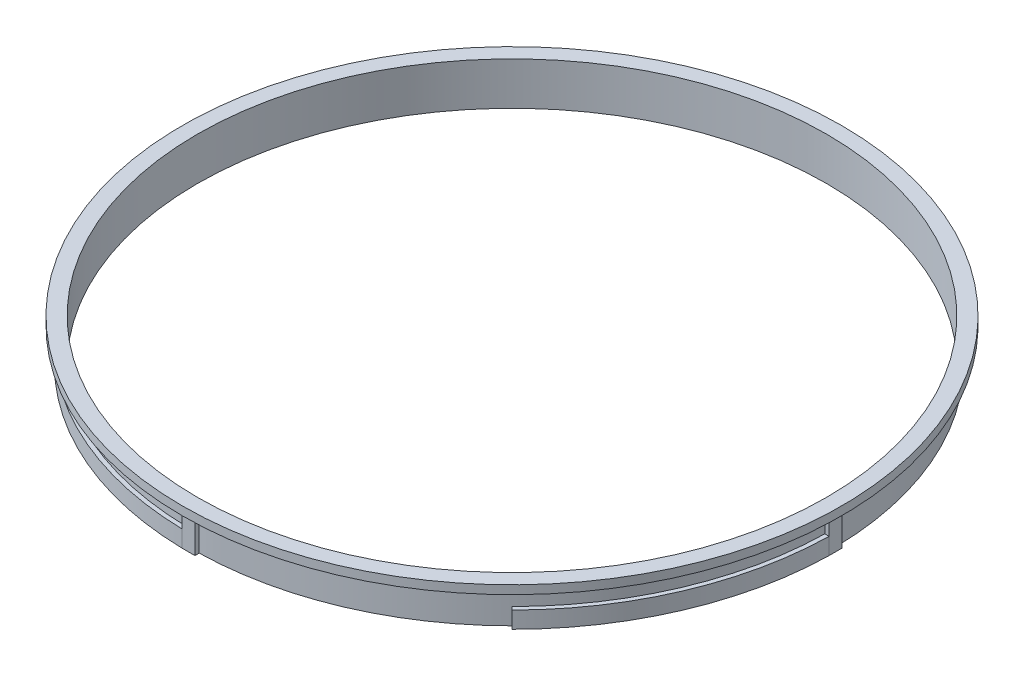
ISO-10303-21;
HEADER;
FILE_DESCRIPTION(('STEP AP214'),'2;1');
FILE_NAME('part.step','',(''),(''),'','','');
FILE_SCHEMA(('AUTOMOTIVE_DESIGN { 1 0 10303 214 1 1 1 1 }'));
ENDSEC;
DATA;
#1=APPLICATION_CONTEXT('core data for automotive mechanical design processes');
#2=APPLICATION_PROTOCOL_DEFINITION('international standard','automotive_design',2000,#1);
#3=PRODUCT_CONTEXT('',#1,'mechanical');
#4=PRODUCT('Part','Part','',(#3));
#5=PRODUCT_RELATED_PRODUCT_CATEGORY('part','',(#4));
#6=PRODUCT_DEFINITION_FORMATION('','',#4);
#7=PRODUCT_DEFINITION_CONTEXT('part definition',#1,'design');
#8=PRODUCT_DEFINITION('design','',#6,#7);
#9=PRODUCT_DEFINITION_SHAPE('','',#8);
#10=(LENGTH_UNIT() NAMED_UNIT(*) SI_UNIT(.MILLI.,.METRE.));
#11=(NAMED_UNIT(*) PLANE_ANGLE_UNIT() SI_UNIT($,.RADIAN.));
#12=(NAMED_UNIT(*) SI_UNIT($,.STERADIAN.) SOLID_ANGLE_UNIT());
#13=UNCERTAINTY_MEASURE_WITH_UNIT(LENGTH_MEASURE(1.E-05),#10,'distance_accuracy_value','');
#14=(GEOMETRIC_REPRESENTATION_CONTEXT(3) GLOBAL_UNCERTAINTY_ASSIGNED_CONTEXT((#13)) GLOBAL_UNIT_ASSIGNED_CONTEXT((#10,
#11,#12)) REPRESENTATION_CONTEXT('',''));
#15=CARTESIAN_POINT('',(0.,0.,0.));
#16=DIRECTION('',(0.,0.,1.));
#17=DIRECTION('',(1.,0.,0.));
#18=AXIS2_PLACEMENT_3D('',#15,#16,#17);
#19=CARTESIAN_POINT('',(0.,10.,0.));
#20=DIRECTION('',(0.,-1.,0.));
#21=DIRECTION('',(0.,0.,-1.));
#22=AXIS2_PLACEMENT_3D('',#19,#20,#21);
#23=CYLINDRICAL_SURFACE('',#22,74.6);
#24=CARTESIAN_POINT('',(0.,8.,0.));
#25=DIRECTION('',(0.,1.,0.));
#26=DIRECTION('',(0.,0.,1.));
#27=AXIS2_PLACEMENT_3D('',#24,#25,#26);
#28=CIRCLE('',#27,74.6);
#29=CARTESIAN_POINT('',(-1.50000000000001,8.,-74.5849180464791));
#30=VERTEX_POINT('',#29);
#31=CARTESIAN_POINT('',(-74.5849180464791,8.,-1.49999999999999));
#32=VERTEX_POINT('',#31);
#33=EDGE_CURVE('E459',#30,#32,#28,.T.);
#34=ORIENTED_EDGE('',*,*,#33,.F.);
#35=DIRECTION('',(0.,-1.,0.));
#36=VECTOR('',#35,1.);
#37=CARTESIAN_POINT('',(-1.50000000000001,13.1622776601684,-74.5849180464791));
#38=LINE('',#37,#36);
#39=CARTESIAN_POINT('',(-1.50000000000001,0.,-74.5849180464791));
#40=VERTEX_POINT('',#39);
#41=EDGE_CURVE('E228',#30,#40,#38,.T.);
#42=ORIENTED_EDGE('',*,*,#41,.T.);
#43=CARTESIAN_POINT('',(0.,0.,0.));
#44=DIRECTION('',(0.,1.,0.));
#45=DIRECTION('',(0.,0.,1.));
#46=AXIS2_PLACEMENT_3D('',#43,#44,#45);
#47=CIRCLE('',#46,74.6);
#48=CARTESIAN_POINT('',(-52.7501658765166,0.,-52.7501658765166));
#49=VERTEX_POINT('',#48);
#50=EDGE_CURVE('E424',#40,#49,#47,.T.);
#51=ORIENTED_EDGE('',*,*,#50,.T.);
#52=DIRECTION('',(0.,-1.,0.));
#53=VECTOR('',#52,1.);
#54=CARTESIAN_POINT('',(-52.7501658765166,3.9,-52.7501658765166));
#55=LINE('',#54,#53);
#56=CARTESIAN_POINT('',(-52.7501658765166,3.9,-52.7501658765166));
#57=VERTEX_POINT('',#56);
#58=EDGE_CURVE('E315',#57,#49,#55,.T.);
#59=ORIENTED_EDGE('',*,*,#58,.F.);
#60=CARTESIAN_POINT('',(0.,3.9,0.));
#61=DIRECTION('',(0.,1.,0.));
#62=DIRECTION('',(0.,0.,1.));
#63=AXIS2_PLACEMENT_3D('',#60,#61,#62);
#64=CIRCLE('',#63,74.6);
#65=CARTESIAN_POINT('',(-74.5849180464791,3.9,-1.49999999999997));
#66=VERTEX_POINT('',#65);
#67=EDGE_CURVE('E303',#57,#66,#64,.T.);
#68=ORIENTED_EDGE('',*,*,#67,.T.);
#69=DIRECTION('',(0.,-1.,0.));
#70=VECTOR('',#69,1.);
#71=CARTESIAN_POINT('',(-74.5849180464791,13.1622776601684,-1.49999999999999));
#72=LINE('',#71,#70);
#73=EDGE_CURVE('E386',#32,#66,#72,.T.);
#74=ORIENTED_EDGE('',*,*,#73,.F.);
#75=EDGE_LOOP('',(#34,#42,#51,#59,#68,#74));
#76=FACE_BOUND('',#75,.T.);
#77=ADVANCED_FACE('F39',(#76),#23,.T.);
#78=CARTESIAN_POINT('',(74.5849180464791,8.,-1.5));
#79=VERTEX_POINT('',#78);
#80=CARTESIAN_POINT('',(1.49999999999999,8.,-74.5849180464791));
#81=VERTEX_POINT('',#80);
#82=EDGE_CURVE('E239',#79,#81,#28,.T.);
#83=ORIENTED_EDGE('',*,*,#82,.F.);
#84=DIRECTION('',(0.,-1.,0.));
#85=VECTOR('',#84,1.);
#86=CARTESIAN_POINT('',(74.5849180464791,13.1622776601684,-1.5));
#87=LINE('',#86,#85);
#88=CARTESIAN_POINT('',(74.5849180464791,0.,-1.5));
#89=VERTEX_POINT('',#88);
#90=EDGE_CURVE('E393',#79,#89,#87,.T.);
#91=ORIENTED_EDGE('',*,*,#90,.T.);
#92=CARTESIAN_POINT('',(52.7501658765166,0.,-52.7501658765166));
#93=VERTEX_POINT('',#92);
#94=EDGE_CURVE('E46',#89,#93,#47,.T.);
#95=ORIENTED_EDGE('',*,*,#94,.T.);
#96=DIRECTION('',(0.,-1.,0.));
#97=VECTOR('',#96,1.);
#98=CARTESIAN_POINT('',(52.7501658765166,3.9,-52.7501658765166));
#99=LINE('',#98,#97);
#100=CARTESIAN_POINT('',(52.7501658765166,3.9,-52.7501658765166));
#101=VERTEX_POINT('',#100);
#102=EDGE_CURVE('E222',#101,#93,#99,.T.);
#103=ORIENTED_EDGE('',*,*,#102,.F.);
#104=CARTESIAN_POINT('',(0.,3.9,0.));
#105=DIRECTION('',(0.,1.,0.));
#106=DIRECTION('',(0.,0.,1.));
#107=AXIS2_PLACEMENT_3D('',#104,#105,#106);
#108=CIRCLE('',#107,74.6);
#109=CARTESIAN_POINT('',(1.49999999999999,3.9,-74.5849180464791));
#110=VERTEX_POINT('',#109);
#111=EDGE_CURVE('E346',#101,#110,#108,.T.);
#112=ORIENTED_EDGE('',*,*,#111,.T.);
#113=DIRECTION('',(0.,-1.,0.));
#114=VECTOR('',#113,1.);
#115=CARTESIAN_POINT('',(1.49999999999999,13.1622776601684,-74.5849180464791));
#116=LINE('',#115,#114);
#117=EDGE_CURVE('E373',#81,#110,#116,.T.);
#118=ORIENTED_EDGE('',*,*,#117,.F.);
#119=EDGE_LOOP('',(#83,#91,#95,#103,#112,#118));
#120=FACE_BOUND('',#119,.T.);
#121=ADVANCED_FACE('F480',(#120),#23,.T.);
#122=CARTESIAN_POINT('',(-74.5849180464791,8.,1.50000000000001));
#123=VERTEX_POINT('',#122);
#124=CARTESIAN_POINT('',(-1.5,8.,74.5849180464791));
#125=VERTEX_POINT('',#124);
#126=EDGE_CURVE('E457',#123,#125,#28,.T.);
#127=ORIENTED_EDGE('',*,*,#126,.F.);
#128=DIRECTION('',(0.,-1.,0.));
#129=VECTOR('',#128,1.);
#130=CARTESIAN_POINT('',(-74.5849180464791,13.1622776601684,1.50000000000001));
#131=LINE('',#130,#129);
#132=CARTESIAN_POINT('',(-74.5849180464791,0.,1.50000000000001));
#133=VERTEX_POINT('',#132);
#134=EDGE_CURVE('E384',#123,#133,#131,.T.);
#135=ORIENTED_EDGE('',*,*,#134,.T.);
#136=CARTESIAN_POINT('',(-52.7501658765208,0.,52.7501658765166));
#137=VERTEX_POINT('',#136);
#138=EDGE_CURVE('E429',#133,#137,#47,.T.);
#139=ORIENTED_EDGE('',*,*,#138,.T.);
#140=DIRECTION('',(0.,-1.,0.));
#141=VECTOR('',#140,1.);
#142=CARTESIAN_POINT('',(-52.7501658765208,3.9,52.7501658765166));
#143=LINE('',#142,#141);
#144=CARTESIAN_POINT('',(-52.7501658765208,3.9,52.7501658765166));
#145=VERTEX_POINT('',#144);
#146=EDGE_CURVE('E340',#145,#137,#143,.T.);
#147=ORIENTED_EDGE('',*,*,#146,.F.);
#148=CARTESIAN_POINT('',(0.,3.9,0.));
#149=DIRECTION('',(0.,1.,0.));
#150=DIRECTION('',(0.,0.,1.));
#151=AXIS2_PLACEMENT_3D('',#148,#149,#150);
#152=CIRCLE('',#151,74.6);
#153=CARTESIAN_POINT('',(-1.49999999999998,3.9,74.5849180464791));
#154=VERTEX_POINT('',#153);
#155=EDGE_CURVE('E328',#145,#154,#152,.T.);
#156=ORIENTED_EDGE('',*,*,#155,.T.);
#157=DIRECTION('',(0.,-1.,0.));
#158=VECTOR('',#157,1.);
#159=CARTESIAN_POINT('',(-1.5,13.1622776601684,74.5849180464791));
#160=LINE('',#159,#158);
#161=EDGE_CURVE('E400',#125,#154,#160,.T.);
#162=ORIENTED_EDGE('',*,*,#161,.F.);
#163=EDGE_LOOP('',(#127,#135,#139,#147,#156,#162));
#164=FACE_BOUND('',#163,.T.);
#165=ADVANCED_FACE('F438',(#164),#23,.T.);
#166=CARTESIAN_POINT('',(1.5,8.,74.5849180464791));
#167=VERTEX_POINT('',#166);
#168=CARTESIAN_POINT('',(74.5849180464791,8.,1.5));
#169=VERTEX_POINT('',#168);
#170=EDGE_CURVE('E461',#167,#169,#28,.T.);
#171=ORIENTED_EDGE('',*,*,#170,.F.);
#172=DIRECTION('',(0.,-1.,0.));
#173=VECTOR('',#172,1.);
#174=CARTESIAN_POINT('',(1.5,13.1622776601684,74.5849180464791));
#175=LINE('',#174,#173);
#176=CARTESIAN_POINT('',(1.5,0.,74.5849180464791));
#177=VERTEX_POINT('',#176);
#178=EDGE_CURVE('E398',#167,#177,#175,.T.);
#179=ORIENTED_EDGE('',*,*,#178,.T.);
#180=CARTESIAN_POINT('',(52.7501658765166,0.,52.7501658765166));
#181=VERTEX_POINT('',#180);
#182=EDGE_CURVE('E421',#177,#181,#47,.T.);
#183=ORIENTED_EDGE('',*,*,#182,.T.);
#184=DIRECTION('',(0.,-1.,0.));
#185=VECTOR('',#184,1.);
#186=CARTESIAN_POINT('',(52.7501658765166,3.9,52.7501658765166));
#187=LINE('',#186,#185);
#188=CARTESIAN_POINT('',(52.7501658765166,3.9,52.7501658765166));
#189=VERTEX_POINT('',#188);
#190=EDGE_CURVE('E290',#189,#181,#187,.T.);
#191=ORIENTED_EDGE('',*,*,#190,.F.);
#192=CARTESIAN_POINT('',(0.,3.9,0.));
#193=DIRECTION('',(0.,1.,0.));
#194=DIRECTION('',(0.,0.,1.));
#195=AXIS2_PLACEMENT_3D('',#192,#193,#194);
#196=CIRCLE('',#195,74.6);
#197=CARTESIAN_POINT('',(74.5849180464791,3.9,1.49999999999998));
#198=VERTEX_POINT('',#197);
#199=EDGE_CURVE('E278',#189,#198,#196,.T.);
#200=ORIENTED_EDGE('',*,*,#199,.T.);
#201=DIRECTION('',(0.,-1.,0.));
#202=VECTOR('',#201,1.);
#203=CARTESIAN_POINT('',(74.5849180464791,13.1622776601684,1.5));
#204=LINE('',#203,#202);
#205=EDGE_CURVE('E413',#169,#198,#204,.T.);
#206=ORIENTED_EDGE('',*,*,#205,.F.);
#207=EDGE_LOOP('',(#171,#179,#183,#191,#200,#206));
#208=FACE_BOUND('',#207,.T.);
#209=ADVANCED_FACE('F482',(#208),#23,.T.);
#210=CARTESIAN_POINT('',(75.5849180464791,13.1622776601684,1.5));
#211=DIRECTION('',(0.,0.,-1.));
#212=DIRECTION('',(-1.,0.,0.));
#213=AXIS2_PLACEMENT_3D('',#210,#211,#212);
#214=PLANE('',#213);
#215=DIRECTION('',(1.,0.,0.));
#216=VECTOR('',#215,1.);
#217=CARTESIAN_POINT('',(75.5849180464791,8.,1.5));
#218=LINE('',#217,#216);
#219=CARTESIAN_POINT('',(75.5849180464791,8.,1.5));
#220=VERTEX_POINT('',#219);
#221=EDGE_CURVE('E53',#169,#220,#218,.T.);
#222=ORIENTED_EDGE('',*,*,#221,.F.);
#223=ORIENTED_EDGE('',*,*,#205,.T.);
#224=DIRECTION('',(-1.,0.,0.));
#225=VECTOR('',#224,1.);
#226=CARTESIAN_POINT('',(0.,3.9,1.49999999999998));
#227=LINE('',#226,#225);
#228=CARTESIAN_POINT('',(75.5849180464791,3.9,1.49999999999998));
#229=VERTEX_POINT('',#228);
#230=EDGE_CURVE('E274',#229,#198,#227,.T.);
#231=ORIENTED_EDGE('',*,*,#230,.F.);
#232=DIRECTION('',(0.,-1.,0.));
#233=VECTOR('',#232,1.);
#234=CARTESIAN_POINT('',(75.5849180464791,13.1622776601684,1.5));
#235=LINE('',#234,#233);
#236=EDGE_CURVE('E412',#220,#229,#235,.T.);
#237=ORIENTED_EDGE('',*,*,#236,.F.);
#238=EDGE_LOOP('',(#222,#223,#231,#237));
#239=FACE_BOUND('',#238,.T.);
#240=ADVANCED_FACE('F487',(#239),#214,.F.);
#241=CARTESIAN_POINT('',(75.5849180464791,13.1622776601684,1.5));
#242=DIRECTION('',(-1.,0.,0.));
#243=DIRECTION('',(0.,0.,1.));
#244=AXIS2_PLACEMENT_3D('',#241,#242,#243);
#245=PLANE('',#244);
#246=DIRECTION('',(0.,0.,-1.));
#247=VECTOR('',#246,1.);
#248=CARTESIAN_POINT('',(75.5849180464791,8.,1.5));
#249=LINE('',#248,#247);
#250=CARTESIAN_POINT('',(75.5849180464791,8.,-1.5));
#251=VERTEX_POINT('',#250);
#252=EDGE_CURVE('E61',#220,#251,#249,.T.);
#253=ORIENTED_EDGE('',*,*,#252,.F.);
#254=ORIENTED_EDGE('',*,*,#236,.T.);
#255=DIRECTION('',(0.,-1.,0.));
#256=VECTOR('',#255,1.);
#257=CARTESIAN_POINT('',(75.5849180464791,3.9,1.49999999999998));
#258=LINE('',#257,#256);
#259=CARTESIAN_POINT('',(75.5849180464791,0.,1.5));
#260=VERTEX_POINT('',#259);
#261=EDGE_CURVE('E292',#229,#260,#258,.T.);
#262=ORIENTED_EDGE('',*,*,#261,.T.);
#263=DIRECTION('',(0.,0.,-1.));
#264=VECTOR('',#263,1.);
#265=CARTESIAN_POINT('',(75.5849180464791,0.,1.5));
#266=LINE('',#265,#264);
#267=CARTESIAN_POINT('',(75.5849180464791,0.,-1.5));
#268=VERTEX_POINT('',#267);
#269=EDGE_CURVE('E409',#260,#268,#266,.T.);
#270=ORIENTED_EDGE('',*,*,#269,.T.);
#271=DIRECTION('',(0.,-1.,0.));
#272=VECTOR('',#271,1.);
#273=CARTESIAN_POINT('',(75.5849180464791,13.1622776601684,-1.5));
#274=LINE('',#273,#272);
#275=EDGE_CURVE('E408',#251,#268,#274,.T.);
#276=ORIENTED_EDGE('',*,*,#275,.F.);
#277=EDGE_LOOP('',(#253,#254,#262,#270,#276));
#278=FACE_BOUND('',#277,.T.);
#279=ADVANCED_FACE('F492',(#278),#245,.F.);
#280=CARTESIAN_POINT('',(75.5849180464791,13.1622776601684,-1.5));
#281=DIRECTION('',(0.,0.,1.));
#282=DIRECTION('',(1.,0.,0.));
#283=AXIS2_PLACEMENT_3D('',#280,#281,#282);
#284=PLANE('',#283);
#285=DIRECTION('',(-1.,0.,0.));
#286=VECTOR('',#285,1.);
#287=CARTESIAN_POINT('',(75.5849180464791,8.,-1.5));
#288=LINE('',#287,#286);
#289=EDGE_CURVE('E266',#251,#79,#288,.T.);
#290=ORIENTED_EDGE('',*,*,#289,.F.);
#291=ORIENTED_EDGE('',*,*,#275,.T.);
#292=DIRECTION('',(-1.,0.,0.));
#293=VECTOR('',#292,1.);
#294=CARTESIAN_POINT('',(75.5849180464791,0.,-1.5));
#295=LINE('',#294,#293);
#296=EDGE_CURVE('E404',#268,#89,#295,.T.);
#297=ORIENTED_EDGE('',*,*,#296,.T.);
#298=ORIENTED_EDGE('',*,*,#90,.F.);
#299=EDGE_LOOP('',(#290,#291,#297,#298));
#300=FACE_BOUND('',#299,.T.);
#301=ADVANCED_FACE('F512',(#300),#284,.F.);
#302=CARTESIAN_POINT('',(1.5,13.1622776601684,75.5849180464791));
#303=DIRECTION('',(-1.,0.,0.));
#304=DIRECTION('',(0.,0.,1.));
#305=AXIS2_PLACEMENT_3D('',#302,#303,#304);
#306=PLANE('',#305);
#307=DIRECTION('',(0.,0.,-1.));
#308=VECTOR('',#307,1.);
#309=CARTESIAN_POINT('',(1.5,8.,75.5849180464791));
#310=LINE('',#309,#308);
#311=CARTESIAN_POINT('',(1.5,8.,75.5849180464791));
#312=VERTEX_POINT('',#311);
#313=EDGE_CURVE('E263',#312,#167,#310,.T.);
#314=ORIENTED_EDGE('',*,*,#313,.F.);
#315=DIRECTION('',(0.,-1.,0.));
#316=VECTOR('',#315,1.);
#317=CARTESIAN_POINT('',(1.5,13.1622776601684,75.5849180464791));
#318=LINE('',#317,#316);
#319=CARTESIAN_POINT('',(1.5,0.,75.5849180464791));
#320=VERTEX_POINT('',#319);
#321=EDGE_CURVE('E379',#312,#320,#318,.T.);
#322=ORIENTED_EDGE('',*,*,#321,.T.);
#323=DIRECTION('',(0.,0.,-1.));
#324=VECTOR('',#323,1.);
#325=CARTESIAN_POINT('',(1.5,0.,75.5849180464791));
#326=LINE('',#325,#324);
#327=EDGE_CURVE('E395',#320,#177,#326,.T.);
#328=ORIENTED_EDGE('',*,*,#327,.T.);
#329=ORIENTED_EDGE('',*,*,#178,.F.);
#330=EDGE_LOOP('',(#314,#322,#328,#329));
#331=FACE_BOUND('',#330,.T.);
#332=ADVANCED_FACE('F496',(#331),#306,.F.);
#333=CARTESIAN_POINT('',(-1.5,13.1622776601684,75.5849180464791));
#334=DIRECTION('',(1.,0.,0.));
#335=DIRECTION('',(0.,0.,-1.));
#336=AXIS2_PLACEMENT_3D('',#333,#334,#335);
#337=PLANE('',#336);
#338=DIRECTION('',(0.,0.,1.));
#339=VECTOR('',#338,1.);
#340=CARTESIAN_POINT('',(-1.5,8.,75.5849180464791));
#341=LINE('',#340,#339);
#342=CARTESIAN_POINT('',(-1.5,8.,75.5849180464791));
#343=VERTEX_POINT('',#342);
#344=EDGE_CURVE('E260',#125,#343,#341,.T.);
#345=ORIENTED_EDGE('',*,*,#344,.F.);
#346=ORIENTED_EDGE('',*,*,#161,.T.);
#347=DIRECTION('',(0.,0.,-1.));
#348=VECTOR('',#347,1.);
#349=CARTESIAN_POINT('',(-1.49999999999998,3.9,0.));
#350=LINE('',#349,#348);
#351=CARTESIAN_POINT('',(-1.49999999999998,3.9,75.5849180464791));
#352=VERTEX_POINT('',#351);
#353=EDGE_CURVE('E324',#352,#154,#350,.T.);
#354=ORIENTED_EDGE('',*,*,#353,.F.);
#355=DIRECTION('',(0.,-1.,0.));
#356=VECTOR('',#355,1.);
#357=CARTESIAN_POINT('',(-1.5,13.1622776601684,75.5849180464791));
#358=LINE('',#357,#356);
#359=EDGE_CURVE('E394',#343,#352,#358,.T.);
#360=ORIENTED_EDGE('',*,*,#359,.F.);
#361=EDGE_LOOP('',(#345,#346,#354,#360));
#362=FACE_BOUND('',#361,.T.);
#363=ADVANCED_FACE('F503',(#362),#337,.F.);
#364=CARTESIAN_POINT('',(-1.5,13.1622776601684,75.5849180464791));
#365=DIRECTION('',(0.,0.,-1.));
#366=DIRECTION('',(-1.,0.,0.));
#367=AXIS2_PLACEMENT_3D('',#364,#365,#366);
#368=PLANE('',#367);
#369=DIRECTION('',(1.,0.,0.));
#370=VECTOR('',#369,1.);
#371=CARTESIAN_POINT('',(-1.5,8.,75.5849180464791));
#372=LINE('',#371,#370);
#373=EDGE_CURVE('E257',#343,#312,#372,.T.);
#374=ORIENTED_EDGE('',*,*,#373,.F.);
#375=ORIENTED_EDGE('',*,*,#359,.T.);
#376=DIRECTION('',(0.,-1.,0.));
#377=VECTOR('',#376,1.);
#378=CARTESIAN_POINT('',(-1.49999999999998,3.9,75.5849180464791));
#379=LINE('',#378,#377);
#380=CARTESIAN_POINT('',(-1.5,0.,75.5849180464791));
#381=VERTEX_POINT('',#380);
#382=EDGE_CURVE('E342',#352,#381,#379,.T.);
#383=ORIENTED_EDGE('',*,*,#382,.T.);
#384=DIRECTION('',(1.,0.,0.));
#385=VECTOR('',#384,1.);
#386=CARTESIAN_POINT('',(-1.5,0.,75.5849180464791));
#387=LINE('',#386,#385);
#388=EDGE_CURVE('E390',#381,#320,#387,.T.);
#389=ORIENTED_EDGE('',*,*,#388,.T.);
#390=ORIENTED_EDGE('',*,*,#321,.F.);
#391=EDGE_LOOP('',(#374,#375,#383,#389,#390));
#392=FACE_BOUND('',#391,.T.);
#393=ADVANCED_FACE('F501',(#392),#368,.F.);
#394=CARTESIAN_POINT('',(-75.5849180464791,13.1622776601684,1.50000000000001));
#395=DIRECTION('',(0.,0.,-1.));
#396=DIRECTION('',(-1.,0.,0.));
#397=AXIS2_PLACEMENT_3D('',#394,#395,#396);
#398=PLANE('',#397);
#399=DIRECTION('',(1.,0.,0.));
#400=VECTOR('',#399,1.);
#401=CARTESIAN_POINT('',(-75.5849180464791,8.,1.50000000000001));
#402=LINE('',#401,#400);
#403=CARTESIAN_POINT('',(-75.5849180464791,8.,1.50000000000001));
#404=VERTEX_POINT('',#403);
#405=EDGE_CURVE('E254',#404,#123,#402,.T.);
#406=ORIENTED_EDGE('',*,*,#405,.F.);
#407=DIRECTION('',(0.,-1.,0.));
#408=VECTOR('',#407,1.);
#409=CARTESIAN_POINT('',(-75.5849180464791,13.1622776601684,1.50000000000001));
#410=LINE('',#409,#408);
#411=CARTESIAN_POINT('',(-75.5849180464791,0.,1.50000000000001));
#412=VERTEX_POINT('',#411);
#413=EDGE_CURVE('E369',#404,#412,#410,.T.);
#414=ORIENTED_EDGE('',*,*,#413,.T.);
#415=DIRECTION('',(1.,0.,0.));
#416=VECTOR('',#415,1.);
#417=CARTESIAN_POINT('',(-75.5849180464791,0.,1.50000000000001));
#418=LINE('',#417,#416);
#419=EDGE_CURVE('E381',#412,#133,#418,.T.);
#420=ORIENTED_EDGE('',*,*,#419,.T.);
#421=ORIENTED_EDGE('',*,*,#134,.F.);
#422=EDGE_LOOP('',(#406,#414,#420,#421));
#423=FACE_BOUND('',#422,.T.);
#424=ADVANCED_FACE('F510',(#423),#398,.F.);
#425=CARTESIAN_POINT('',(-75.5849180464791,13.1622776601684,-1.49999999999999));
#426=DIRECTION('',(0.,0.,1.));
#427=DIRECTION('',(1.,0.,0.));
#428=AXIS2_PLACEMENT_3D('',#425,#426,#427);
#429=PLANE('',#428);
#430=DIRECTION('',(-1.,0.,0.));
#431=VECTOR('',#430,1.);
#432=CARTESIAN_POINT('',(-75.5849180464791,8.,-1.49999999999999));
#433=LINE('',#432,#431);
#434=CARTESIAN_POINT('',(-75.5849180464791,8.,-1.49999999999999));
#435=VERTEX_POINT('',#434);
#436=EDGE_CURVE('E251',#32,#435,#433,.T.);
#437=ORIENTED_EDGE('',*,*,#436,.F.);
#438=ORIENTED_EDGE('',*,*,#73,.T.);
#439=DIRECTION('',(1.,0.,0.));
#440=VECTOR('',#439,1.);
#441=CARTESIAN_POINT('',(0.,3.9,-1.49999999999999));
#442=LINE('',#441,#440);
#443=CARTESIAN_POINT('',(-75.5849180464791,3.9,-1.49999999999997));
#444=VERTEX_POINT('',#443);
#445=EDGE_CURVE('E299',#444,#66,#442,.T.);
#446=ORIENTED_EDGE('',*,*,#445,.F.);
#447=DIRECTION('',(0.,-1.,0.));
#448=VECTOR('',#447,1.);
#449=CARTESIAN_POINT('',(-75.5849180464791,13.1622776601684,-1.49999999999999));
#450=LINE('',#449,#448);
#451=EDGE_CURVE('E380',#435,#444,#450,.T.);
#452=ORIENTED_EDGE('',*,*,#451,.F.);
#453=EDGE_LOOP('',(#437,#438,#446,#452));
#454=FACE_BOUND('',#453,.T.);
#455=ADVANCED_FACE('F674',(#454),#429,.F.);
#456=CARTESIAN_POINT('',(-75.5849180464791,13.1622776601684,-1.49999999999999));
#457=DIRECTION('',(1.,0.,0.));
#458=DIRECTION('',(0.,0.,-1.));
#459=AXIS2_PLACEMENT_3D('',#456,#457,#458);
#460=PLANE('',#459);
#461=DIRECTION('',(0.,0.,1.));
#462=VECTOR('',#461,1.);
#463=CARTESIAN_POINT('',(-75.5849180464791,8.,-1.49999999999999));
#464=LINE('',#463,#462);
#465=EDGE_CURVE('E231',#435,#404,#464,.T.);
#466=ORIENTED_EDGE('',*,*,#465,.F.);
#467=ORIENTED_EDGE('',*,*,#451,.T.);
#468=DIRECTION('',(0.,-1.,0.));
#469=VECTOR('',#468,1.);
#470=CARTESIAN_POINT('',(-75.5849180464791,3.9,-1.49999999999997));
#471=LINE('',#470,#469);
#472=CARTESIAN_POINT('',(-75.5849180464791,0.,-1.49999999999999));
#473=VERTEX_POINT('',#472);
#474=EDGE_CURVE('E317',#444,#473,#471,.T.);
#475=ORIENTED_EDGE('',*,*,#474,.T.);
#476=DIRECTION('',(0.,0.,1.));
#477=VECTOR('',#476,1.);
#478=CARTESIAN_POINT('',(-75.5849180464791,0.,-1.49999999999999));
#479=LINE('',#478,#477);
#480=EDGE_CURVE('E376',#473,#412,#479,.T.);
#481=ORIENTED_EDGE('',*,*,#480,.T.);
#482=ORIENTED_EDGE('',*,*,#413,.F.);
#483=EDGE_LOOP('',(#466,#467,#475,#481,#482));
#484=FACE_BOUND('',#483,.T.);
#485=ADVANCED_FACE('F665',(#484),#460,.F.);
#486=CARTESIAN_POINT('',(-1.50000000000001,13.1622776601684,-75.5849180464791));
#487=DIRECTION('',(1.,0.,0.));
#488=DIRECTION('',(0.,0.,-1.));
#489=AXIS2_PLACEMENT_3D('',#486,#487,#488);
#490=PLANE('',#489);
#491=DIRECTION('',(0.,0.,1.));
#492=VECTOR('',#491,1.);
#493=CARTESIAN_POINT('',(-1.50000000000001,8.,-75.5849180464791));
#494=LINE('',#493,#492);
#495=CARTESIAN_POINT('',(-1.50000000000001,8.,-75.5849180464791));
#496=VERTEX_POINT('',#495);
#497=EDGE_CURVE('E226',#496,#30,#494,.T.);
#498=ORIENTED_EDGE('',*,*,#497,.F.);
#499=DIRECTION('',(0.,-1.,0.));
#500=VECTOR('',#499,1.);
#501=CARTESIAN_POINT('',(-1.50000000000001,13.1622776601684,-75.5849180464791));
#502=LINE('',#501,#500);
#503=CARTESIAN_POINT('',(-1.50000000000001,0.,-75.5849180464791));
#504=VERTEX_POINT('',#503);
#505=EDGE_CURVE('E211',#496,#504,#502,.T.);
#506=ORIENTED_EDGE('',*,*,#505,.T.);
#507=DIRECTION('',(0.,0.,1.));
#508=VECTOR('',#507,1.);
#509=CARTESIAN_POINT('',(-1.50000000000001,0.,-75.5849180464791));
#510=LINE('',#509,#508);
#511=EDGE_CURVE('E221',#504,#40,#510,.T.);
#512=ORIENTED_EDGE('',*,*,#511,.T.);
#513=ORIENTED_EDGE('',*,*,#41,.F.);
#514=EDGE_LOOP('',(#498,#506,#512,#513));
#515=FACE_BOUND('',#514,.T.);
#516=ADVANCED_FACE('F227',(#515),#490,.F.);
#517=CARTESIAN_POINT('',(1.49999999999999,13.1622776601684,-75.5849180464791));
#518=DIRECTION('',(-1.,0.,0.));
#519=DIRECTION('',(0.,0.,1.));
#520=AXIS2_PLACEMENT_3D('',#517,#518,#519);
#521=PLANE('',#520);
#522=DIRECTION('',(0.,0.,-1.));
#523=VECTOR('',#522,1.);
#524=CARTESIAN_POINT('',(1.49999999999999,8.,-75.5849180464791));
#525=LINE('',#524,#523);
#526=CARTESIAN_POINT('',(1.49999999999999,8.,-75.5849180464791));
#527=VERTEX_POINT('',#526);
#528=EDGE_CURVE('E232',#81,#527,#525,.T.);
#529=ORIENTED_EDGE('',*,*,#528,.F.);
#530=ORIENTED_EDGE('',*,*,#117,.T.);
#531=DIRECTION('',(0.,0.,1.));
#532=VECTOR('',#531,1.);
#533=CARTESIAN_POINT('',(1.49999999999999,3.9,0.));
#534=LINE('',#533,#532);
#535=CARTESIAN_POINT('',(1.49999999999999,3.9,-75.5849180464791));
#536=VERTEX_POINT('',#535);
#537=EDGE_CURVE('E356',#536,#110,#534,.T.);
#538=ORIENTED_EDGE('',*,*,#537,.F.);
#539=DIRECTION('',(0.,-1.,0.));
#540=VECTOR('',#539,1.);
#541=CARTESIAN_POINT('',(1.49999999999999,13.1622776601684,-75.5849180464791));
#542=LINE('',#541,#540);
#543=EDGE_CURVE('E370',#527,#536,#542,.T.);
#544=ORIENTED_EDGE('',*,*,#543,.F.);
#545=EDGE_LOOP('',(#529,#530,#538,#544));
#546=FACE_BOUND('',#545,.T.);
#547=ADVANCED_FACE('F648',(#546),#521,.F.);
#548=CARTESIAN_POINT('',(1.49999999999999,13.1622776601684,-75.5849180464791));
#549=DIRECTION('',(0.,0.,1.));
#550=DIRECTION('',(1.,0.,0.));
#551=AXIS2_PLACEMENT_3D('',#548,#549,#550);
#552=PLANE('',#551);
#553=DIRECTION('',(-1.,0.,0.));
#554=VECTOR('',#553,1.);
#555=CARTESIAN_POINT('',(1.49999999999999,8.,-75.5849180464791));
#556=LINE('',#555,#554);
#557=EDGE_CURVE('E11',#527,#496,#556,.T.);
#558=ORIENTED_EDGE('',*,*,#557,.F.);
#559=ORIENTED_EDGE('',*,*,#543,.T.);
#560=DIRECTION('',(0.,-1.,0.));
#561=VECTOR('',#560,1.);
#562=CARTESIAN_POINT('',(1.49999999999999,3.9,-75.5849180464791));
#563=LINE('',#562,#561);
#564=CARTESIAN_POINT('',(1.49999999999999,0.,-75.5849180464791));
#565=VERTEX_POINT('',#564);
#566=EDGE_CURVE('E359',#536,#565,#563,.T.);
#567=ORIENTED_EDGE('',*,*,#566,.T.);
#568=DIRECTION('',(-1.,0.,0.));
#569=VECTOR('',#568,1.);
#570=CARTESIAN_POINT('',(1.49999999999999,0.,-75.5849180464791));
#571=LINE('',#570,#569);
#572=EDGE_CURVE('E217',#565,#504,#571,.T.);
#573=ORIENTED_EDGE('',*,*,#572,.T.);
#574=ORIENTED_EDGE('',*,*,#505,.F.);
#575=EDGE_LOOP('',(#558,#559,#567,#573,#574));
#576=FACE_BOUND('',#575,.T.);
#577=ADVANCED_FACE('F213',(#576),#552,.F.);
#578=CARTESIAN_POINT('',(0.,10.,0.));
#579=DIRECTION('',(0.,1.,0.));
#580=DIRECTION('',(0.,0.,1.));
#581=AXIS2_PLACEMENT_3D('',#578,#579,#580);
#582=PLANE('',#581);
#583=CARTESIAN_POINT('',(0.,10.,0.));
#584=DIRECTION('',(0.,1.,0.));
#585=DIRECTION('',(0.,0.,1.));
#586=AXIS2_PLACEMENT_3D('',#583,#584,#585);
#587=CIRCLE('',#586,77.);
#588=CARTESIAN_POINT('',(0.,10.,77.));
#589=VERTEX_POINT('',#588);
#590=EDGE_CURVE('E245',#589,#589,#587,.T.);
#591=ORIENTED_EDGE('',*,*,#590,.T.);
#592=EDGE_LOOP('',(#591));
#593=FACE_BOUND('',#592,.T.);
#594=CARTESIAN_POINT('',(0.,10.,0.));
#595=DIRECTION('',(0.,1.,0.));
#596=DIRECTION('',(0.,0.,1.));
#597=AXIS2_PLACEMENT_3D('',#594,#595,#596);
#598=CIRCLE('',#597,73.5);
#599=CARTESIAN_POINT('',(0.,10.,73.5));
#600=VERTEX_POINT('',#599);
#601=EDGE_CURVE('E418',#600,#600,#598,.T.);
#602=ORIENTED_EDGE('',*,*,#601,.F.);
#603=EDGE_LOOP('',(#602));
#604=FACE_BOUND('',#603,.T.);
#605=ADVANCED_FACE('F465',(#593,#604),#582,.T.);
#606=CARTESIAN_POINT('',(0.,0.,0.));
#607=DIRECTION('',(0.,1.,0.));
#608=DIRECTION('',(0.,0.,1.));
#609=AXIS2_PLACEMENT_3D('',#606,#607,#608);
#610=PLANE('',#609);
#611=ORIENTED_EDGE('',*,*,#50,.F.);
#612=ORIENTED_EDGE('',*,*,#511,.F.);
#613=ORIENTED_EDGE('',*,*,#572,.F.);
#614=CARTESIAN_POINT('',(0.,0.,0.));
#615=DIRECTION('',(0.,1.,0.));
#616=DIRECTION('',(0.,0.,1.));
#617=AXIS2_PLACEMENT_3D('',#614,#615,#616);
#618=CIRCLE('',#617,75.5998005029971);
#619=CARTESIAN_POINT('',(53.4571315920193,0.,-53.4571315920193));
#620=VERTEX_POINT('',#619);
#621=EDGE_CURVE('E350',#565,#620,#618,.F.);
#622=ORIENTED_EDGE('',*,*,#621,.T.);
#623=DIRECTION('',(-0.707106781186548,0.,0.707106781186548));
#624=VECTOR('',#623,1.);
#625=CARTESIAN_POINT('',(0.,0.,0.));
#626=LINE('',#625,#624);
#627=EDGE_CURVE('E345',#620,#93,#626,.T.);
#628=ORIENTED_EDGE('',*,*,#627,.T.);
#629=ORIENTED_EDGE('',*,*,#94,.F.);
#630=ORIENTED_EDGE('',*,*,#296,.F.);
#631=ORIENTED_EDGE('',*,*,#269,.F.);
#632=CARTESIAN_POINT('',(0.,0.,0.));
#633=DIRECTION('',(0.,1.,0.));
#634=DIRECTION('',(0.,0.,1.));
#635=AXIS2_PLACEMENT_3D('',#632,#633,#634);
#636=CIRCLE('',#635,75.5998005029971);
#637=CARTESIAN_POINT('',(53.4571315920193,0.,53.4571315920193));
#638=VERTEX_POINT('',#637);
#639=EDGE_CURVE('E270',#260,#638,#636,.F.);
#640=ORIENTED_EDGE('',*,*,#639,.T.);
#641=DIRECTION('',(-0.707106781186548,0.,-0.707106781186548));
#642=VECTOR('',#641,1.);
#643=CARTESIAN_POINT('',(0.,0.,0.));
#644=LINE('',#643,#642);
#645=EDGE_CURVE('E275',#638,#181,#644,.T.);
#646=ORIENTED_EDGE('',*,*,#645,.T.);
#647=ORIENTED_EDGE('',*,*,#182,.F.);
#648=ORIENTED_EDGE('',*,*,#327,.F.);
#649=ORIENTED_EDGE('',*,*,#388,.F.);
#650=CARTESIAN_POINT('',(0.,0.,0.));
#651=DIRECTION('',(0.,1.,0.));
#652=DIRECTION('',(0.,0.,1.));
#653=AXIS2_PLACEMENT_3D('',#650,#651,#652);
#654=CIRCLE('',#653,75.5998005029971);
#655=CARTESIAN_POINT('',(-53.4571315920193,0.,53.4571315920151));
#656=VERTEX_POINT('',#655);
#657=EDGE_CURVE('E320',#381,#656,#654,.F.);
#658=ORIENTED_EDGE('',*,*,#657,.T.);
#659=DIRECTION('',(0.707106781186575,0.,-0.70710678118652));
#660=VECTOR('',#659,1.);
#661=CARTESIAN_POINT('',(0.,0.,0.));
#662=LINE('',#661,#660);
#663=EDGE_CURVE('E325',#656,#137,#662,.T.);
#664=ORIENTED_EDGE('',*,*,#663,.T.);
#665=ORIENTED_EDGE('',*,*,#138,.F.);
#666=ORIENTED_EDGE('',*,*,#419,.F.);
#667=ORIENTED_EDGE('',*,*,#480,.F.);
#668=CARTESIAN_POINT('',(0.,0.,0.));
#669=DIRECTION('',(0.,1.,0.));
#670=DIRECTION('',(0.,0.,1.));
#671=AXIS2_PLACEMENT_3D('',#668,#669,#670);
#672=CIRCLE('',#671,75.5998005029971);
#673=CARTESIAN_POINT('',(-53.4571315920193,0.,-53.4571315920193));
#674=VERTEX_POINT('',#673);
#675=EDGE_CURVE('E295',#473,#674,#672,.F.);
#676=ORIENTED_EDGE('',*,*,#675,.T.);
#677=DIRECTION('',(0.707106781186548,0.,0.707106781186548));
#678=VECTOR('',#677,1.);
#679=CARTESIAN_POINT('',(0.,0.,0.));
#680=LINE('',#679,#678);
#681=EDGE_CURVE('E300',#674,#49,#680,.T.);
#682=ORIENTED_EDGE('',*,*,#681,.T.);
#683=EDGE_LOOP('',(#611,#612,#613,#622,#628,#629,#630,#631,#640,#646,#647,#648,#649,#658,#664,
#665,#666,#667,#676,#682));
#684=FACE_BOUND('',#683,.T.);
#685=CARTESIAN_POINT('',(0.,0.,0.));
#686=DIRECTION('',(0.,1.,0.));
#687=DIRECTION('',(0.,0.,1.));
#688=AXIS2_PLACEMENT_3D('',#685,#686,#687);
#689=CIRCLE('',#688,73.5);
#690=CARTESIAN_POINT('',(0.,0.,73.5));
#691=VERTEX_POINT('',#690);
#692=EDGE_CURVE('E407',#691,#691,#689,.T.);
#693=ORIENTED_EDGE('',*,*,#692,.T.);
#694=EDGE_LOOP('',(#693));
#695=FACE_BOUND('',#694,.T.);
#696=ADVANCED_FACE('F443',(#684,#695),#610,.F.);
#697=CARTESIAN_POINT('',(0.,10.,0.));
#698=DIRECTION('',(0.,-1.,0.));
#699=DIRECTION('',(0.,0.,-1.));
#700=AXIS2_PLACEMENT_3D('',#697,#698,#699);
#701=CYLINDRICAL_SURFACE('',#700,73.5);
#702=ORIENTED_EDGE('',*,*,#601,.T.);
#703=EDGE_LOOP('',(#702));
#704=FACE_BOUND('',#703,.T.);
#705=ORIENTED_EDGE('',*,*,#692,.F.);
#706=EDGE_LOOP('',(#705));
#707=FACE_BOUND('',#706,.T.);
#708=ADVANCED_FACE('F521',(#704,#707),#701,.F.);
#709=CARTESIAN_POINT('',(0.,3.9,0.));
#710=DIRECTION('',(0.707106781186547,0.,0.707106781186547));
#711=DIRECTION('',(0.707106781186548,0.,-0.707106781186548));
#712=AXIS2_PLACEMENT_3D('',#709,#710,#711);
#713=PLANE('',#712);
#714=ORIENTED_EDGE('',*,*,#627,.F.);
#715=DIRECTION('',(0.,-1.,0.));
#716=VECTOR('',#715,1.);
#717=CARTESIAN_POINT('',(53.4571315920193,3.9,-53.4571315920193));
#718=LINE('',#717,#716);
#719=CARTESIAN_POINT('',(53.4571315920193,3.9,-53.4571315920193));
#720=VERTEX_POINT('',#719);
#721=EDGE_CURVE('E365',#720,#620,#718,.T.);
#722=ORIENTED_EDGE('',*,*,#721,.F.);
#723=DIRECTION('',(-0.707106781186548,0.,0.707106781186548));
#724=VECTOR('',#723,1.);
#725=CARTESIAN_POINT('',(0.,3.9,0.));
#726=LINE('',#725,#724);
#727=EDGE_CURVE('E349',#720,#101,#726,.T.);
#728=ORIENTED_EDGE('',*,*,#727,.T.);
#729=ORIENTED_EDGE('',*,*,#102,.T.);
#730=EDGE_LOOP('',(#714,#722,#728,#729));
#731=FACE_BOUND('',#730,.T.);
#732=ADVANCED_FACE('F524',(#731),#713,.T.);
#733=CARTESIAN_POINT('',(0.,3.9,0.));
#734=DIRECTION('',(0.,-1.,0.));
#735=DIRECTION('',(0.,0.,-1.));
#736=AXIS2_PLACEMENT_3D('',#733,#734,#735);
#737=CYLINDRICAL_SURFACE('',#736,75.5998005029971);
#738=ORIENTED_EDGE('',*,*,#621,.F.);
#739=ORIENTED_EDGE('',*,*,#566,.F.);
#740=CARTESIAN_POINT('',(0.,3.9,0.));
#741=DIRECTION('',(0.,1.,0.));
#742=DIRECTION('',(0.,0.,1.));
#743=AXIS2_PLACEMENT_3D('',#740,#741,#742);
#744=CIRCLE('',#743,75.5998005029971);
#745=EDGE_CURVE('E353',#536,#720,#744,.F.);
#746=ORIENTED_EDGE('',*,*,#745,.T.);
#747=ORIENTED_EDGE('',*,*,#721,.T.);
#748=EDGE_LOOP('',(#738,#739,#746,#747));
#749=FACE_BOUND('',#748,.T.);
#750=ADVANCED_FACE('F543',(#749),#737,.T.);
#751=CARTESIAN_POINT('',(0.,3.9,0.));
#752=DIRECTION('',(0.,1.,0.));
#753=DIRECTION('',(0.,0.,1.));
#754=AXIS2_PLACEMENT_3D('',#751,#752,#753);
#755=PLANE('',#754);
#756=ORIENTED_EDGE('',*,*,#111,.F.);
#757=ORIENTED_EDGE('',*,*,#727,.F.);
#758=ORIENTED_EDGE('',*,*,#745,.F.);
#759=ORIENTED_EDGE('',*,*,#537,.T.);
#760=EDGE_LOOP('',(#756,#757,#758,#759));
#761=FACE_BOUND('',#760,.T.);
#762=ADVANCED_FACE('F551',(#761),#755,.T.);
#763=CARTESIAN_POINT('',(0.,3.9,0.));
#764=DIRECTION('',(0.,-1.,0.));
#765=DIRECTION('',(0.,0.,-1.));
#766=AXIS2_PLACEMENT_3D('',#763,#764,#765);
#767=CYLINDRICAL_SURFACE('',#766,75.5998005029971);
#768=ORIENTED_EDGE('',*,*,#657,.F.);
#769=ORIENTED_EDGE('',*,*,#382,.F.);
#770=CARTESIAN_POINT('',(0.,3.9,0.));
#771=DIRECTION('',(0.,1.,0.));
#772=DIRECTION('',(0.,0.,1.));
#773=AXIS2_PLACEMENT_3D('',#770,#771,#772);
#774=CIRCLE('',#773,75.5998005029971);
#775=CARTESIAN_POINT('',(-53.4571315920193,3.9,53.4571315920151));
#776=VERTEX_POINT('',#775);
#777=EDGE_CURVE('E321',#352,#776,#774,.F.);
#778=ORIENTED_EDGE('',*,*,#777,.T.);
#779=DIRECTION('',(0.,-1.,0.));
#780=VECTOR('',#779,1.);
#781=CARTESIAN_POINT('',(-53.4571315920193,3.9,53.4571315920151));
#782=LINE('',#781,#780);
#783=EDGE_CURVE('E334',#776,#656,#782,.T.);
#784=ORIENTED_EDGE('',*,*,#783,.T.);
#785=EDGE_LOOP('',(#768,#769,#778,#784));
#786=FACE_BOUND('',#785,.T.);
#787=ADVANCED_FACE('F559',(#786),#767,.T.);
#788=CARTESIAN_POINT('',(0.,3.9,0.));
#789=DIRECTION('',(-0.70710678118652,0.,-0.707106781186575));
#790=DIRECTION('',(-0.707106781186575,0.,0.70710678118652));
#791=AXIS2_PLACEMENT_3D('',#788,#789,#790);
#792=PLANE('',#791);
#793=ORIENTED_EDGE('',*,*,#663,.F.);
#794=ORIENTED_EDGE('',*,*,#783,.F.);
#795=DIRECTION('',(0.707106781186575,0.,-0.70710678118652));
#796=VECTOR('',#795,1.);
#797=CARTESIAN_POINT('',(0.,3.9,0.));
#798=LINE('',#797,#796);
#799=EDGE_CURVE('E331',#776,#145,#798,.T.);
#800=ORIENTED_EDGE('',*,*,#799,.T.);
#801=ORIENTED_EDGE('',*,*,#146,.T.);
#802=EDGE_LOOP('',(#793,#794,#800,#801));
#803=FACE_BOUND('',#802,.T.);
#804=ADVANCED_FACE('F449',(#803),#792,.T.);
#805=CARTESIAN_POINT('',(0.,3.9,0.));
#806=DIRECTION('',(0.,1.,0.));
#807=DIRECTION('',(0.,0.,1.));
#808=AXIS2_PLACEMENT_3D('',#805,#806,#807);
#809=PLANE('',#808);
#810=ORIENTED_EDGE('',*,*,#777,.F.);
#811=ORIENTED_EDGE('',*,*,#353,.T.);
#812=ORIENTED_EDGE('',*,*,#155,.F.);
#813=ORIENTED_EDGE('',*,*,#799,.F.);
#814=EDGE_LOOP('',(#810,#811,#812,#813));
#815=FACE_BOUND('',#814,.T.);
#816=ADVANCED_FACE('F453',(#815),#809,.T.);
#817=CARTESIAN_POINT('',(0.,3.9,0.));
#818=DIRECTION('',(0.,-1.,0.));
#819=DIRECTION('',(0.,0.,-1.));
#820=AXIS2_PLACEMENT_3D('',#817,#818,#819);
#821=CYLINDRICAL_SURFACE('',#820,75.5998005029971);
#822=ORIENTED_EDGE('',*,*,#675,.F.);
#823=ORIENTED_EDGE('',*,*,#474,.F.);
#824=CARTESIAN_POINT('',(0.,3.9,0.));
#825=DIRECTION('',(0.,1.,0.));
#826=DIRECTION('',(0.,0.,1.));
#827=AXIS2_PLACEMENT_3D('',#824,#825,#826);
#828=CIRCLE('',#827,75.5998005029971);
#829=CARTESIAN_POINT('',(-53.4571315920193,3.9,-53.4571315920193));
#830=VERTEX_POINT('',#829);
#831=EDGE_CURVE('E296',#444,#830,#828,.F.);
#832=ORIENTED_EDGE('',*,*,#831,.T.);
#833=DIRECTION('',(0.,-1.,0.));
#834=VECTOR('',#833,1.);
#835=CARTESIAN_POINT('',(-53.4571315920193,3.9,-53.4571315920193));
#836=LINE('',#835,#834);
#837=EDGE_CURVE('E309',#830,#674,#836,.T.);
#838=ORIENTED_EDGE('',*,*,#837,.T.);
#839=EDGE_LOOP('',(#822,#823,#832,#838));
#840=FACE_BOUND('',#839,.T.);
#841=ADVANCED_FACE('F580',(#840),#821,.T.);
#842=CARTESIAN_POINT('',(0.,3.9,0.));
#843=DIRECTION('',(0.707106781186547,0.,-0.707106781186547));
#844=DIRECTION('',(-0.707106781186548,0.,-0.707106781186548));
#845=AXIS2_PLACEMENT_3D('',#842,#843,#844);
#846=PLANE('',#845);
#847=ORIENTED_EDGE('',*,*,#681,.F.);
#848=ORIENTED_EDGE('',*,*,#837,.F.);
#849=DIRECTION('',(0.707106781186548,0.,0.707106781186548));
#850=VECTOR('',#849,1.);
#851=CARTESIAN_POINT('',(0.,3.9,0.));
#852=LINE('',#851,#850);
#853=EDGE_CURVE('E306',#830,#57,#852,.T.);
#854=ORIENTED_EDGE('',*,*,#853,.T.);
#855=ORIENTED_EDGE('',*,*,#58,.T.);
#856=EDGE_LOOP('',(#847,#848,#854,#855));
#857=FACE_BOUND('',#856,.T.);
#858=ADVANCED_FACE('F587',(#857),#846,.T.);
#859=CARTESIAN_POINT('',(0.,3.9,0.));
#860=DIRECTION('',(0.,1.,0.));
#861=DIRECTION('',(0.,0.,1.));
#862=AXIS2_PLACEMENT_3D('',#859,#860,#861);
#863=PLANE('',#862);
#864=ORIENTED_EDGE('',*,*,#831,.F.);
#865=ORIENTED_EDGE('',*,*,#445,.T.);
#866=ORIENTED_EDGE('',*,*,#67,.F.);
#867=ORIENTED_EDGE('',*,*,#853,.F.);
#868=EDGE_LOOP('',(#864,#865,#866,#867));
#869=FACE_BOUND('',#868,.T.);
#870=ADVANCED_FACE('F595',(#869),#863,.T.);
#871=CARTESIAN_POINT('',(0.,3.9,0.));
#872=DIRECTION('',(0.,-1.,0.));
#873=DIRECTION('',(0.,0.,-1.));
#874=AXIS2_PLACEMENT_3D('',#871,#872,#873);
#875=CYLINDRICAL_SURFACE('',#874,75.5998005029971);
#876=ORIENTED_EDGE('',*,*,#639,.F.);
#877=ORIENTED_EDGE('',*,*,#261,.F.);
#878=CARTESIAN_POINT('',(0.,3.9,0.));
#879=DIRECTION('',(0.,1.,0.));
#880=DIRECTION('',(0.,0.,1.));
#881=AXIS2_PLACEMENT_3D('',#878,#879,#880);
#882=CIRCLE('',#881,75.5998005029971);
#883=CARTESIAN_POINT('',(53.4571315920193,3.9,53.4571315920193));
#884=VERTEX_POINT('',#883);
#885=EDGE_CURVE('E271',#229,#884,#882,.F.);
#886=ORIENTED_EDGE('',*,*,#885,.T.);
#887=DIRECTION('',(0.,-1.,0.));
#888=VECTOR('',#887,1.);
#889=CARTESIAN_POINT('',(53.4571315920193,3.9,53.4571315920193));
#890=LINE('',#889,#888);
#891=EDGE_CURVE('E284',#884,#638,#890,.T.);
#892=ORIENTED_EDGE('',*,*,#891,.T.);
#893=EDGE_LOOP('',(#876,#877,#886,#892));
#894=FACE_BOUND('',#893,.T.);
#895=ADVANCED_FACE('F603',(#894),#875,.T.);
#896=CARTESIAN_POINT('',(0.,3.9,0.));
#897=DIRECTION('',(-0.707106781186547,0.,0.707106781186547));
#898=DIRECTION('',(0.707106781186548,0.,0.707106781186548));
#899=AXIS2_PLACEMENT_3D('',#896,#897,#898);
#900=PLANE('',#899);
#901=ORIENTED_EDGE('',*,*,#645,.F.);
#902=ORIENTED_EDGE('',*,*,#891,.F.);
#903=DIRECTION('',(-0.707106781186548,0.,-0.707106781186548));
#904=VECTOR('',#903,1.);
#905=CARTESIAN_POINT('',(0.,3.9,0.));
#906=LINE('',#905,#904);
#907=EDGE_CURVE('E281',#884,#189,#906,.T.);
#908=ORIENTED_EDGE('',*,*,#907,.T.);
#909=ORIENTED_EDGE('',*,*,#190,.T.);
#910=EDGE_LOOP('',(#901,#902,#908,#909));
#911=FACE_BOUND('',#910,.T.);
#912=ADVANCED_FACE('F611',(#911),#900,.T.);
#913=CARTESIAN_POINT('',(0.,3.9,0.));
#914=DIRECTION('',(0.,1.,0.));
#915=DIRECTION('',(0.,0.,1.));
#916=AXIS2_PLACEMENT_3D('',#913,#914,#915);
#917=PLANE('',#916);
#918=ORIENTED_EDGE('',*,*,#885,.F.);
#919=ORIENTED_EDGE('',*,*,#230,.T.);
#920=ORIENTED_EDGE('',*,*,#199,.F.);
#921=ORIENTED_EDGE('',*,*,#907,.F.);
#922=EDGE_LOOP('',(#918,#919,#920,#921));
#923=FACE_BOUND('',#922,.T.);
#924=ADVANCED_FACE('F475',(#923),#917,.T.);
#925=CARTESIAN_POINT('',(0.,8.,0.));
#926=DIRECTION('',(0.,1.,0.));
#927=DIRECTION('',(0.,0.,1.));
#928=AXIS2_PLACEMENT_3D('',#925,#926,#927);
#929=PLANE('',#928);
#930=CARTESIAN_POINT('',(0.,8.,0.));
#931=DIRECTION('',(0.,1.,0.));
#932=DIRECTION('',(0.,0.,1.));
#933=AXIS2_PLACEMENT_3D('',#930,#931,#932);
#934=CIRCLE('',#933,77.);
#935=CARTESIAN_POINT('',(0.,8.,77.));
#936=VERTEX_POINT('',#935);
#937=EDGE_CURVE('E242',#936,#936,#934,.T.);
#938=ORIENTED_EDGE('',*,*,#937,.F.);
#939=EDGE_LOOP('',(#938));
#940=FACE_BOUND('',#939,.T.);
#941=ORIENTED_EDGE('',*,*,#170,.T.);
#942=ORIENTED_EDGE('',*,*,#221,.T.);
#943=ORIENTED_EDGE('',*,*,#252,.T.);
#944=ORIENTED_EDGE('',*,*,#289,.T.);
#945=ORIENTED_EDGE('',*,*,#82,.T.);
#946=ORIENTED_EDGE('',*,*,#528,.T.);
#947=ORIENTED_EDGE('',*,*,#557,.T.);
#948=ORIENTED_EDGE('',*,*,#497,.T.);
#949=ORIENTED_EDGE('',*,*,#33,.T.);
#950=ORIENTED_EDGE('',*,*,#436,.T.);
#951=ORIENTED_EDGE('',*,*,#465,.T.);
#952=ORIENTED_EDGE('',*,*,#405,.T.);
#953=ORIENTED_EDGE('',*,*,#126,.T.);
#954=ORIENTED_EDGE('',*,*,#344,.T.);
#955=ORIENTED_EDGE('',*,*,#373,.T.);
#956=ORIENTED_EDGE('',*,*,#313,.T.);
#957=EDGE_LOOP('',(#941,#942,#943,#944,#945,#946,#947,#948,#949,#950,#951,#952,#953,#954,#955,#956));
#958=FACE_BOUND('',#957,.T.);
#959=ADVANCED_FACE('F236',(#940,#958),#929,.F.);
#960=CARTESIAN_POINT('',(0.,8.,0.));
#961=DIRECTION('',(0.,1.,0.));
#962=DIRECTION('',(0.,0.,1.));
#963=AXIS2_PLACEMENT_3D('',#960,#961,#962);
#964=CYLINDRICAL_SURFACE('',#963,77.);
#965=ORIENTED_EDGE('',*,*,#937,.T.);
#966=EDGE_LOOP('',(#965));
#967=FACE_BOUND('',#966,.T.);
#968=ORIENTED_EDGE('',*,*,#590,.F.);
#969=EDGE_LOOP('',(#968));
#970=FACE_BOUND('',#969,.T.);
#971=ADVANCED_FACE('F468',(#967,#970),#964,.T.);
#972=CLOSED_SHELL('',(#77,#121,#165,#209,#240,#279,#301,#332,#363,#393,#424,#455,#485,#516,#547,
#577,#605,#696,#708,#732,#750,#762,#787,#804,#816,#841,#858,#870,#895,#912,#924,#959,#971));
#973=MANIFOLD_SOLID_BREP('B2',#972);
#974=ADVANCED_BREP_SHAPE_REPRESENTATION('',(#18,#973),#14);
#975=SHAPE_DEFINITION_REPRESENTATION(#9,#974);
ENDSEC;
END-ISO-10303-21;
